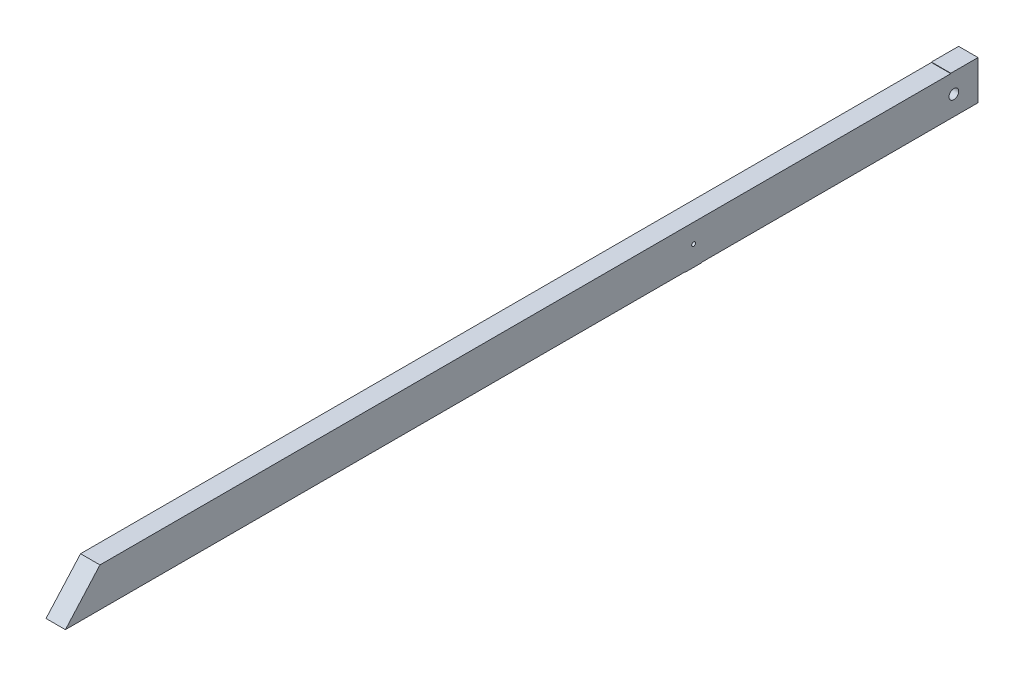
ISO-10303-21;
HEADER;
FILE_DESCRIPTION(('STEP AP214'),'2;1');
FILE_NAME('part.step','',(''),(''),'','','');
FILE_SCHEMA(('AUTOMOTIVE_DESIGN { 1 0 10303 214 1 1 1 1 }'));
ENDSEC;
DATA;
#1=APPLICATION_CONTEXT('core data for automotive mechanical design processes');
#2=APPLICATION_PROTOCOL_DEFINITION('international standard','automotive_design',2000,#1);
#3=PRODUCT_CONTEXT('',#1,'mechanical');
#4=PRODUCT('Part','Part','',(#3));
#5=PRODUCT_RELATED_PRODUCT_CATEGORY('part','',(#4));
#6=PRODUCT_DEFINITION_FORMATION('','',#4);
#7=PRODUCT_DEFINITION_CONTEXT('part definition',#1,'design');
#8=PRODUCT_DEFINITION('design','',#6,#7);
#9=PRODUCT_DEFINITION_SHAPE('','',#8);
#10=(LENGTH_UNIT() NAMED_UNIT(*) SI_UNIT(.MILLI.,.METRE.));
#11=(NAMED_UNIT(*) PLANE_ANGLE_UNIT() SI_UNIT($,.RADIAN.));
#12=(NAMED_UNIT(*) SI_UNIT($,.STERADIAN.) SOLID_ANGLE_UNIT());
#13=UNCERTAINTY_MEASURE_WITH_UNIT(LENGTH_MEASURE(1.E-05),#10,'distance_accuracy_value','');
#14=(GEOMETRIC_REPRESENTATION_CONTEXT(3) GLOBAL_UNCERTAINTY_ASSIGNED_CONTEXT((#13)) GLOBAL_UNIT_ASSIGNED_CONTEXT((#10,
#11,#12)) REPRESENTATION_CONTEXT('',''));
#15=CARTESIAN_POINT('',(0.,0.,0.));
#16=DIRECTION('',(0.,0.,1.));
#17=DIRECTION('',(1.,0.,0.));
#18=AXIS2_PLACEMENT_3D('',#15,#16,#17);
#19=CARTESIAN_POINT('',(0.,0.,2262.74));
#20=DIRECTION('',(0.,1.,0.));
#21=DIRECTION('',(0.,0.,1.));
#22=AXIS2_PLACEMENT_3D('',#19,#20,#21);
#23=PLANE('',#22);
#24=DIRECTION('',(-1.,0.,0.));
#25=VECTOR('',#24,1.);
#26=CARTESIAN_POINT('',(0.,0.,754.24));
#27=LINE('',#26,#25);
#28=CARTESIAN_POINT('',(50.,0.,754.24));
#29=VERTEX_POINT('',#28);
#30=CARTESIAN_POINT('',(0.,0.,754.24));
#31=VERTEX_POINT('',#30);
#32=EDGE_CURVE('E153',#29,#31,#27,.T.);
#33=ORIENTED_EDGE('',*,*,#32,.F.);
#34=DIRECTION('',(0.,0.,-1.));
#35=VECTOR('',#34,1.);
#36=CARTESIAN_POINT('',(50.,0.,2262.74));
#37=LINE('',#36,#35);
#38=CARTESIAN_POINT('',(50.,0.,2351.7649485909));
#39=VERTEX_POINT('',#38);
#40=EDGE_CURVE('E197',#39,#29,#37,.T.);
#41=ORIENTED_EDGE('',*,*,#40,.F.);
#42=DIRECTION('',(1.,0.,0.));
#43=VECTOR('',#42,1.);
#44=CARTESIAN_POINT('',(0.,0.,2351.7649485909));
#45=LINE('',#44,#43);
#46=CARTESIAN_POINT('',(0.,0.,2351.7649485909));
#47=VERTEX_POINT('',#46);
#48=EDGE_CURVE('E135',#47,#39,#45,.T.);
#49=ORIENTED_EDGE('',*,*,#48,.F.);
#50=DIRECTION('',(0.,0.,-1.));
#51=VECTOR('',#50,1.);
#52=CARTESIAN_POINT('',(0.,0.,2262.74));
#53=LINE('',#52,#51);
#54=EDGE_CURVE('E11',#47,#31,#53,.T.);
#55=ORIENTED_EDGE('',*,*,#54,.T.);
#56=EDGE_LOOP('',(#33,#41,#49,#55));
#57=FACE_BOUND('',#56,.T.);
#58=ADVANCED_FACE('F35',(#57),#23,.F.);
#59=DIRECTION('',(1.,0.,0.));
#60=VECTOR('',#59,1.);
#61=CARTESIAN_POINT('',(0.,0.,711.536486553474));
#62=LINE('',#61,#60);
#63=CARTESIAN_POINT('',(0.,0.,711.536486553474));
#64=VERTEX_POINT('',#63);
#65=CARTESIAN_POINT('',(50.,0.,711.536486553474));
#66=VERTEX_POINT('',#65);
#67=EDGE_CURVE('E51',#64,#66,#62,.T.);
#68=ORIENTED_EDGE('',*,*,#67,.F.);
#69=CARTESIAN_POINT('',(0.,0.,0.));
#70=VERTEX_POINT('',#69);
#71=EDGE_CURVE('E44',#64,#70,#53,.T.);
#72=ORIENTED_EDGE('',*,*,#71,.T.);
#73=DIRECTION('',(1.,0.,0.));
#74=VECTOR('',#73,1.);
#75=CARTESIAN_POINT('',(0.,0.,0.));
#76=LINE('',#75,#74);
#77=CARTESIAN_POINT('',(50.,0.,0.));
#78=VERTEX_POINT('',#77);
#79=EDGE_CURVE('E191',#70,#78,#76,.T.);
#80=ORIENTED_EDGE('',*,*,#79,.T.);
#81=EDGE_CURVE('E196',#66,#78,#37,.T.);
#82=ORIENTED_EDGE('',*,*,#81,.F.);
#83=EDGE_LOOP('',(#68,#72,#80,#82));
#84=FACE_BOUND('',#83,.T.);
#85=ADVANCED_FACE('F207',(#84),#23,.F.);
#86=CARTESIAN_POINT('',(0.,100.,2262.74));
#87=DIRECTION('',(0.,-1.,0.));
#88=DIRECTION('',(0.,0.,-1.));
#89=AXIS2_PLACEMENT_3D('',#86,#87,#88);
#90=PLANE('',#89);
#91=DIRECTION('',(1.,0.,0.));
#92=VECTOR('',#91,1.);
#93=CARTESIAN_POINT('',(0.,100.,70.0270668981231));
#94=LINE('',#93,#92);
#95=CARTESIAN_POINT('',(0.,100.,70.0270668981231));
#96=VERTEX_POINT('',#95);
#97=CARTESIAN_POINT('',(50.,100.,70.0270668981231));
#98=VERTEX_POINT('',#97);
#99=EDGE_CURVE('E117',#96,#98,#94,.T.);
#100=ORIENTED_EDGE('',*,*,#99,.F.);
#101=DIRECTION('',(0.,0.,-1.));
#102=VECTOR('',#101,1.);
#103=CARTESIAN_POINT('',(0.,100.,2262.74));
#104=LINE('',#103,#102);
#105=CARTESIAN_POINT('',(0.,100.,2262.74));
#106=VERTEX_POINT('',#105);
#107=EDGE_CURVE('E111',#106,#96,#104,.T.);
#108=ORIENTED_EDGE('',*,*,#107,.F.);
#109=DIRECTION('',(-1.,0.,0.));
#110=VECTOR('',#109,1.);
#111=CARTESIAN_POINT('',(0.,100.,2262.74));
#112=LINE('',#111,#110);
#113=CARTESIAN_POINT('',(50.,100.,2262.74));
#114=VERTEX_POINT('',#113);
#115=EDGE_CURVE('E114',#114,#106,#112,.T.);
#116=ORIENTED_EDGE('',*,*,#115,.F.);
#117=DIRECTION('',(0.,0.,-1.));
#118=VECTOR('',#117,1.);
#119=CARTESIAN_POINT('',(50.,100.,2262.74));
#120=LINE('',#119,#118);
#121=EDGE_CURVE('E122',#114,#98,#120,.T.);
#122=ORIENTED_EDGE('',*,*,#121,.T.);
#123=EDGE_LOOP('',(#100,#108,#116,#122));
#124=FACE_BOUND('',#123,.T.);
#125=ADVANCED_FACE('F113',(#124),#90,.F.);
#126=CARTESIAN_POINT('',(0.,0.,2262.74));
#127=DIRECTION('',(1.,0.,0.));
#128=DIRECTION('',(0.,0.,-1.));
#129=AXIS2_PLACEMENT_3D('',#126,#127,#128);
#130=PLANE('',#129);
#131=CARTESIAN_POINT('',(0.,50.5,62.2694574148066));
#132=DIRECTION('',(-1.,0.,0.));
#133=DIRECTION('',(0.,0.,1.));
#134=AXIS2_PLACEMENT_3D('',#131,#132,#133);
#135=CIRCLE('',#134,12.5);
#136=CARTESIAN_POINT('',(0.,50.5,74.7694574148066));
#137=VERTEX_POINT('',#136);
#138=EDGE_CURVE('E137',#137,#137,#135,.T.);
#139=ORIENTED_EDGE('',*,*,#138,.F.);
#140=EDGE_LOOP('',(#139));
#141=FACE_BOUND('',#140,.T.);
#142=CARTESIAN_POINT('',(0.,51.0589027698052,732.888243276737));
#143=DIRECTION('',(1.,0.,0.));
#144=DIRECTION('',(0.,0.,-1.));
#145=AXIS2_PLACEMENT_3D('',#142,#143,#144);
#146=CIRCLE('',#145,5.00000000000005);
#147=CARTESIAN_POINT('',(0.,51.0589027698052,727.888243276737));
#148=VERTEX_POINT('',#147);
#149=EDGE_CURVE('E146',#148,#148,#146,.T.);
#150=ORIENTED_EDGE('',*,*,#149,.T.);
#151=EDGE_LOOP('',(#150));
#152=FACE_BOUND('',#151,.T.);
#153=DIRECTION('',(0.,-1.,0.));
#154=VECTOR('',#153,1.);
#155=CARTESIAN_POINT('',(0.,0.,0.));
#156=LINE('',#155,#154);
#157=CARTESIAN_POINT('',(0.,101.,0.));
#158=VERTEX_POINT('',#157);
#159=EDGE_CURVE('E188',#158,#70,#156,.T.);
#160=ORIENTED_EDGE('',*,*,#159,.T.);
#161=ORIENTED_EDGE('',*,*,#71,.F.);
#162=DIRECTION('',(0.,1.,0.));
#163=VECTOR('',#162,1.);
#164=CARTESIAN_POINT('',(0.,-1.,711.536486553474));
#165=LINE('',#164,#163);
#166=CARTESIAN_POINT('',(0.,-1.,711.536486553474));
#167=VERTEX_POINT('',#166);
#168=EDGE_CURVE('E169',#167,#64,#165,.T.);
#169=ORIENTED_EDGE('',*,*,#168,.F.);
#170=DIRECTION('',(0.,0.,-1.));
#171=VECTOR('',#170,1.);
#172=CARTESIAN_POINT('',(0.,-1.,711.536486553474));
#173=LINE('',#172,#171);
#174=CARTESIAN_POINT('',(0.,-1.,754.24));
#175=VERTEX_POINT('',#174);
#176=EDGE_CURVE('E149',#175,#167,#173,.T.);
#177=ORIENTED_EDGE('',*,*,#176,.F.);
#178=DIRECTION('',(0.,1.,0.));
#179=VECTOR('',#178,1.);
#180=CARTESIAN_POINT('',(0.,-1.,754.24));
#181=LINE('',#180,#179);
#182=EDGE_CURVE('E159',#175,#31,#181,.T.);
#183=ORIENTED_EDGE('',*,*,#182,.T.);
#184=ORIENTED_EDGE('',*,*,#54,.F.);
#185=DIRECTION('',(0.,-0.746904489341509,0.664931337659385));
#186=VECTOR('',#185,1.);
#187=CARTESIAN_POINT('',(0.,0.,2351.7649485909));
#188=LINE('',#187,#186);
#189=EDGE_CURVE('E128',#106,#47,#188,.T.);
#190=ORIENTED_EDGE('',*,*,#189,.F.);
#191=ORIENTED_EDGE('',*,*,#107,.T.);
#192=DIRECTION('',(0.,-1.,0.));
#193=VECTOR('',#192,1.);
#194=CARTESIAN_POINT('',(0.,101.,70.0270668981231));
#195=LINE('',#194,#193);
#196=CARTESIAN_POINT('',(0.,101.,70.0270668981231));
#197=VERTEX_POINT('',#196);
#198=EDGE_CURVE('E187',#197,#96,#195,.T.);
#199=ORIENTED_EDGE('',*,*,#198,.F.);
#200=DIRECTION('',(0.,0.,1.));
#201=VECTOR('',#200,1.);
#202=CARTESIAN_POINT('',(0.,101.,0.));
#203=LINE('',#202,#201);
#204=EDGE_CURVE('E172',#158,#197,#203,.T.);
#205=ORIENTED_EDGE('',*,*,#204,.F.);
#206=EDGE_LOOP('',(#160,#161,#169,#177,#183,#184,#190,#191,#199,#205));
#207=FACE_BOUND('',#206,.T.);
#208=ADVANCED_FACE('F37',(#141,#152,#207),#130,.F.);
#209=CARTESIAN_POINT('',(50.,0.,2262.74));
#210=DIRECTION('',(-1.,0.,0.));
#211=DIRECTION('',(0.,0.,1.));
#212=AXIS2_PLACEMENT_3D('',#209,#210,#211);
#213=PLANE('',#212);
#214=CARTESIAN_POINT('',(50.,50.5,62.2694574148066));
#215=DIRECTION('',(-1.,0.,0.));
#216=DIRECTION('',(0.,0.,1.));
#217=AXIS2_PLACEMENT_3D('',#214,#215,#216);
#218=CIRCLE('',#217,12.5);
#219=CARTESIAN_POINT('',(50.,50.5,74.7694574148066));
#220=VERTEX_POINT('',#219);
#221=EDGE_CURVE('E39',#220,#220,#218,.T.);
#222=ORIENTED_EDGE('',*,*,#221,.T.);
#223=EDGE_LOOP('',(#222));
#224=FACE_BOUND('',#223,.T.);
#225=CARTESIAN_POINT('',(50.,51.0589027698052,732.888243276737));
#226=DIRECTION('',(1.,0.,0.));
#227=DIRECTION('',(0.,0.,-1.));
#228=AXIS2_PLACEMENT_3D('',#225,#226,#227);
#229=CIRCLE('',#228,5.00000000000005);
#230=CARTESIAN_POINT('',(50.,51.0589027698052,727.888243276737));
#231=VERTEX_POINT('',#230);
#232=EDGE_CURVE('E143',#231,#231,#229,.T.);
#233=ORIENTED_EDGE('',*,*,#232,.F.);
#234=EDGE_LOOP('',(#233));
#235=FACE_BOUND('',#234,.T.);
#236=DIRECTION('',(0.,1.,0.));
#237=VECTOR('',#236,1.);
#238=CARTESIAN_POINT('',(50.,0.,0.));
#239=LINE('',#238,#237);
#240=CARTESIAN_POINT('',(50.,101.,0.));
#241=VERTEX_POINT('',#240);
#242=EDGE_CURVE('E131',#78,#241,#239,.T.);
#243=ORIENTED_EDGE('',*,*,#242,.T.);
#244=DIRECTION('',(0.,0.,-1.));
#245=VECTOR('',#244,1.);
#246=CARTESIAN_POINT('',(50.,101.,0.));
#247=LINE('',#246,#245);
#248=CARTESIAN_POINT('',(50.,101.,70.0270668981231));
#249=VERTEX_POINT('',#248);
#250=EDGE_CURVE('E177',#249,#241,#247,.T.);
#251=ORIENTED_EDGE('',*,*,#250,.F.);
#252=DIRECTION('',(0.,-1.,0.));
#253=VECTOR('',#252,1.);
#254=CARTESIAN_POINT('',(50.,101.,70.0270668981231));
#255=LINE('',#254,#253);
#256=EDGE_CURVE('E183',#249,#98,#255,.T.);
#257=ORIENTED_EDGE('',*,*,#256,.T.);
#258=ORIENTED_EDGE('',*,*,#121,.F.);
#259=DIRECTION('',(0.,-0.746904489341509,0.664931337659385));
#260=VECTOR('',#259,1.);
#261=CARTESIAN_POINT('',(50.,0.,2351.7649485909));
#262=LINE('',#261,#260);
#263=EDGE_CURVE('E130',#114,#39,#262,.T.);
#264=ORIENTED_EDGE('',*,*,#263,.T.);
#265=ORIENTED_EDGE('',*,*,#40,.T.);
#266=DIRECTION('',(0.,1.,0.));
#267=VECTOR('',#266,1.);
#268=CARTESIAN_POINT('',(50.,-1.,754.24));
#269=LINE('',#268,#267);
#270=CARTESIAN_POINT('',(50.,-1.,754.24));
#271=VERTEX_POINT('',#270);
#272=EDGE_CURVE('E163',#271,#29,#269,.T.);
#273=ORIENTED_EDGE('',*,*,#272,.F.);
#274=DIRECTION('',(0.,0.,1.));
#275=VECTOR('',#274,1.);
#276=CARTESIAN_POINT('',(50.,-1.,711.536486553474));
#277=LINE('',#276,#275);
#278=CARTESIAN_POINT('',(50.,-1.,711.536486553474));
#279=VERTEX_POINT('',#278);
#280=EDGE_CURVE('E155',#279,#271,#277,.T.);
#281=ORIENTED_EDGE('',*,*,#280,.F.);
#282=DIRECTION('',(0.,1.,0.));
#283=VECTOR('',#282,1.);
#284=CARTESIAN_POINT('',(50.,-1.,711.536486553474));
#285=LINE('',#284,#283);
#286=EDGE_CURVE('E166',#279,#66,#285,.T.);
#287=ORIENTED_EDGE('',*,*,#286,.T.);
#288=ORIENTED_EDGE('',*,*,#81,.T.);
#289=EDGE_LOOP('',(#243,#251,#257,#258,#264,#265,#273,#281,#287,#288));
#290=FACE_BOUND('',#289,.T.);
#291=ADVANCED_FACE('F201',(#224,#235,#290),#213,.F.);
#292=CARTESIAN_POINT('',(0.,0.,0.));
#293=DIRECTION('',(0.,0.,-1.));
#294=DIRECTION('',(-1.,0.,0.));
#295=AXIS2_PLACEMENT_3D('',#292,#293,#294);
#296=PLANE('',#295);
#297=ORIENTED_EDGE('',*,*,#159,.F.);
#298=DIRECTION('',(-1.,0.,0.));
#299=VECTOR('',#298,1.);
#300=CARTESIAN_POINT('',(0.,101.,0.));
#301=LINE('',#300,#299);
#302=EDGE_CURVE('E180',#241,#158,#301,.T.);
#303=ORIENTED_EDGE('',*,*,#302,.F.);
#304=ORIENTED_EDGE('',*,*,#242,.F.);
#305=ORIENTED_EDGE('',*,*,#79,.F.);
#306=EDGE_LOOP('',(#297,#303,#304,#305));
#307=FACE_BOUND('',#306,.T.);
#308=ADVANCED_FACE('F210',(#307),#296,.T.);
#309=CARTESIAN_POINT('',(0.,101.,70.0270668981231));
#310=DIRECTION('',(0.,0.,-1.));
#311=DIRECTION('',(-1.,0.,0.));
#312=AXIS2_PLACEMENT_3D('',#309,#310,#311);
#313=PLANE('',#312);
#314=ORIENTED_EDGE('',*,*,#99,.T.);
#315=ORIENTED_EDGE('',*,*,#256,.F.);
#316=DIRECTION('',(1.,0.,0.));
#317=VECTOR('',#316,1.);
#318=CARTESIAN_POINT('',(0.,101.,70.0270668981231));
#319=LINE('',#318,#317);
#320=EDGE_CURVE('E175',#197,#249,#319,.T.);
#321=ORIENTED_EDGE('',*,*,#320,.F.);
#322=ORIENTED_EDGE('',*,*,#198,.T.);
#323=EDGE_LOOP('',(#314,#315,#321,#322));
#324=FACE_BOUND('',#323,.T.);
#325=ADVANCED_FACE('F215',(#324),#313,.F.);
#326=CARTESIAN_POINT('',(0.,101.,0.));
#327=DIRECTION('',(0.,1.,0.));
#328=DIRECTION('',(0.,0.,1.));
#329=AXIS2_PLACEMENT_3D('',#326,#327,#328);
#330=PLANE('',#329);
#331=ORIENTED_EDGE('',*,*,#204,.T.);
#332=ORIENTED_EDGE('',*,*,#320,.T.);
#333=ORIENTED_EDGE('',*,*,#250,.T.);
#334=ORIENTED_EDGE('',*,*,#302,.T.);
#335=EDGE_LOOP('',(#331,#332,#333,#334));
#336=FACE_BOUND('',#335,.T.);
#337=ADVANCED_FACE('F213',(#336),#330,.T.);
#338=CARTESIAN_POINT('',(0.,-1.,711.536486553474));
#339=DIRECTION('',(0.,0.,1.));
#340=DIRECTION('',(1.,0.,0.));
#341=AXIS2_PLACEMENT_3D('',#338,#339,#340);
#342=PLANE('',#341);
#343=ORIENTED_EDGE('',*,*,#67,.T.);
#344=ORIENTED_EDGE('',*,*,#286,.F.);
#345=DIRECTION('',(1.,0.,0.));
#346=VECTOR('',#345,1.);
#347=CARTESIAN_POINT('',(0.,-1.,711.536486553474));
#348=LINE('',#347,#346);
#349=EDGE_CURVE('E152',#167,#279,#348,.T.);
#350=ORIENTED_EDGE('',*,*,#349,.F.);
#351=ORIENTED_EDGE('',*,*,#168,.T.);
#352=EDGE_LOOP('',(#343,#344,#350,#351));
#353=FACE_BOUND('',#352,.T.);
#354=ADVANCED_FACE('F223',(#353),#342,.F.);
#355=CARTESIAN_POINT('',(0.,-1.,754.24));
#356=DIRECTION('',(0.,0.,-1.));
#357=DIRECTION('',(-1.,0.,0.));
#358=AXIS2_PLACEMENT_3D('',#355,#356,#357);
#359=PLANE('',#358);
#360=ORIENTED_EDGE('',*,*,#32,.T.);
#361=ORIENTED_EDGE('',*,*,#182,.F.);
#362=DIRECTION('',(-1.,0.,0.));
#363=VECTOR('',#362,1.);
#364=CARTESIAN_POINT('',(0.,-1.,754.24));
#365=LINE('',#364,#363);
#366=EDGE_CURVE('E157',#271,#175,#365,.T.);
#367=ORIENTED_EDGE('',*,*,#366,.F.);
#368=ORIENTED_EDGE('',*,*,#272,.T.);
#369=EDGE_LOOP('',(#360,#361,#367,#368));
#370=FACE_BOUND('',#369,.T.);
#371=ADVANCED_FACE('F257',(#370),#359,.F.);
#372=CARTESIAN_POINT('',(0.,-1.,0.));
#373=DIRECTION('',(0.,1.,0.));
#374=DIRECTION('',(0.,0.,1.));
#375=AXIS2_PLACEMENT_3D('',#372,#373,#374);
#376=PLANE('',#375);
#377=ORIENTED_EDGE('',*,*,#176,.T.);
#378=ORIENTED_EDGE('',*,*,#349,.T.);
#379=ORIENTED_EDGE('',*,*,#280,.T.);
#380=ORIENTED_EDGE('',*,*,#366,.T.);
#381=EDGE_LOOP('',(#377,#378,#379,#380));
#382=FACE_BOUND('',#381,.T.);
#383=ADVANCED_FACE('F248',(#382),#376,.F.);
#384=CARTESIAN_POINT('',(-259.,51.0589027698052,732.888243276737));
#385=DIRECTION('',(1.,0.,0.));
#386=DIRECTION('',(0.,0.,-1.));
#387=AXIS2_PLACEMENT_3D('',#384,#385,#386);
#388=CYLINDRICAL_SURFACE('',#387,5.00000000000005);
#389=ORIENTED_EDGE('',*,*,#232,.T.);
#390=EDGE_LOOP('',(#389));
#391=FACE_BOUND('',#390,.T.);
#392=ORIENTED_EDGE('',*,*,#149,.F.);
#393=EDGE_LOOP('',(#392));
#394=FACE_BOUND('',#393,.T.);
#395=ADVANCED_FACE('F245',(#391,#394),#388,.F.);
#396=CARTESIAN_POINT('',(100.,50.5,62.2694574148066));
#397=DIRECTION('',(-1.,0.,0.));
#398=DIRECTION('',(0.,0.,1.));
#399=AXIS2_PLACEMENT_3D('',#396,#397,#398);
#400=CYLINDRICAL_SURFACE('',#399,12.5);
#401=ORIENTED_EDGE('',*,*,#138,.T.);
#402=EDGE_LOOP('',(#401));
#403=FACE_BOUND('',#402,.T.);
#404=ORIENTED_EDGE('',*,*,#221,.F.);
#405=EDGE_LOOP('',(#404));
#406=FACE_BOUND('',#405,.T.);
#407=ADVANCED_FACE('F247',(#403,#406),#400,.F.);
#408=CARTESIAN_POINT('',(0.,0.,2351.7649485909));
#409=DIRECTION('',(0.,0.664931337659385,0.746904489341509));
#410=DIRECTION('',(0.,-0.746904489341509,0.664931337659385));
#411=AXIS2_PLACEMENT_3D('',#408,#409,#410);
#412=PLANE('',#411);
#413=ORIENTED_EDGE('',*,*,#263,.F.);
#414=ORIENTED_EDGE('',*,*,#115,.T.);
#415=ORIENTED_EDGE('',*,*,#189,.T.);
#416=ORIENTED_EDGE('',*,*,#48,.T.);
#417=EDGE_LOOP('',(#413,#414,#415,#416));
#418=FACE_BOUND('',#417,.T.);
#419=ADVANCED_FACE('F126',(#418),#412,.T.);
#420=CLOSED_SHELL('',(#58,#85,#125,#208,#291,#308,#325,#337,#354,#371,#383,#395,#407,#419));
#421=MANIFOLD_SOLID_BREP('B2',#420);
#422=ADVANCED_BREP_SHAPE_REPRESENTATION('',(#18,#421),#14);
#423=SHAPE_DEFINITION_REPRESENTATION(#9,#422);
ENDSEC;
END-ISO-10303-21;
